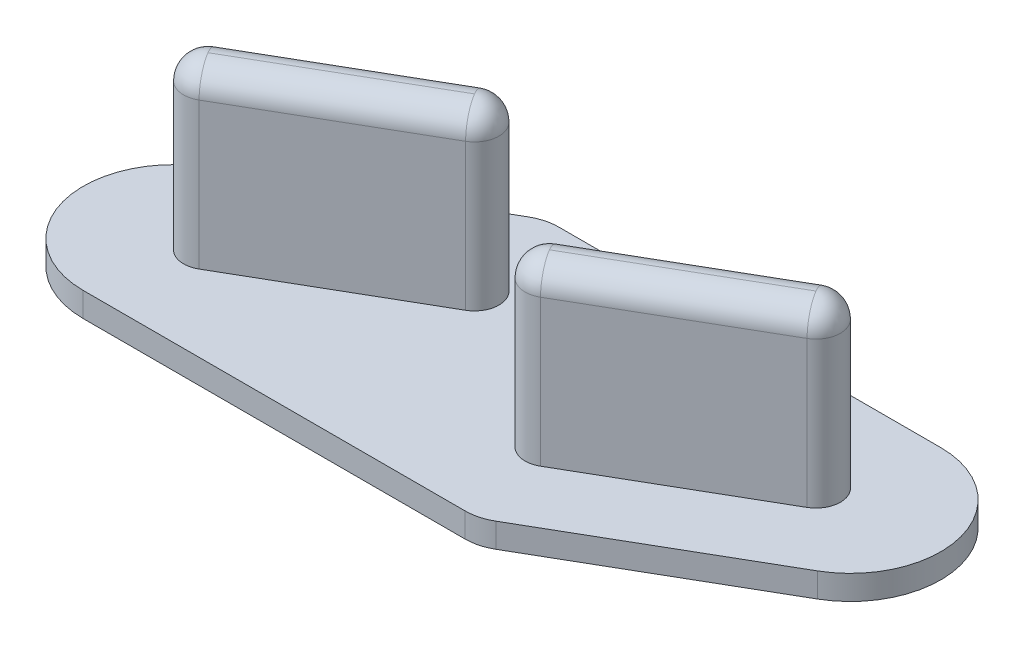
ISO-10303-21;
HEADER;
FILE_DESCRIPTION(('STEP AP214'),'2;1');
FILE_NAME('part.step','',(''),(''),'','','');
FILE_SCHEMA(('AUTOMOTIVE_DESIGN { 1 0 10303 214 1 1 1 1 }'));
ENDSEC;
DATA;
#1=APPLICATION_CONTEXT('core data for automotive mechanical design processes');
#2=APPLICATION_PROTOCOL_DEFINITION('international standard','automotive_design',2000,#1);
#3=PRODUCT_CONTEXT('',#1,'mechanical');
#4=PRODUCT('Part','Part','',(#3));
#5=PRODUCT_RELATED_PRODUCT_CATEGORY('part','',(#4));
#6=PRODUCT_DEFINITION_FORMATION('','',#4);
#7=PRODUCT_DEFINITION_CONTEXT('part definition',#1,'design');
#8=PRODUCT_DEFINITION('design','',#6,#7);
#9=PRODUCT_DEFINITION_SHAPE('','',#8);
#10=(LENGTH_UNIT() NAMED_UNIT(*) SI_UNIT(.MILLI.,.METRE.));
#11=(NAMED_UNIT(*) PLANE_ANGLE_UNIT() SI_UNIT($,.RADIAN.));
#12=(NAMED_UNIT(*) SI_UNIT($,.STERADIAN.) SOLID_ANGLE_UNIT());
#13=UNCERTAINTY_MEASURE_WITH_UNIT(LENGTH_MEASURE(1.E-05),#10,'distance_accuracy_value','');
#14=(GEOMETRIC_REPRESENTATION_CONTEXT(3) GLOBAL_UNCERTAINTY_ASSIGNED_CONTEXT((#13)) GLOBAL_UNIT_ASSIGNED_CONTEXT((#10,
#11,#12)) REPRESENTATION_CONTEXT('',''));
#15=CARTESIAN_POINT('',(0.,0.,0.));
#16=DIRECTION('',(0.,0.,1.));
#17=DIRECTION('',(1.,0.,0.));
#18=AXIS2_PLACEMENT_3D('',#15,#16,#17);
#19=CARTESIAN_POINT('',(0.,1.,0.));
#20=DIRECTION('',(0.,-1.,0.));
#21=DIRECTION('',(0.,0.,-1.));
#22=AXIS2_PLACEMENT_3D('',#19,#20,#21);
#23=CYLINDRICAL_SURFACE('',#22,3.7013113167179);
#24=CARTESIAN_POINT('',(0.,0.,0.));
#25=DIRECTION('',(0.,1.,0.));
#26=DIRECTION('',(0.,0.,1.));
#27=AXIS2_PLACEMENT_3D('',#24,#25,#26);
#28=CIRCLE('',#27,3.7013113167179);
#29=CARTESIAN_POINT('',(-1.85065565835895,0.,-3.20542962759253));
#30=VERTEX_POINT('',#29);
#31=CARTESIAN_POINT('',(0.,0.,3.7013113167179));
#32=VERTEX_POINT('',#31);
#33=EDGE_CURVE('E177',#30,#32,#28,.T.);
#34=ORIENTED_EDGE('',*,*,#33,.T.);
#35=DIRECTION('',(0.,-1.,0.));
#36=VECTOR('',#35,1.);
#37=CARTESIAN_POINT('',(0.,1.,3.7013113167179));
#38=LINE('',#37,#36);
#39=CARTESIAN_POINT('',(0.,1.,3.7013113167179));
#40=VERTEX_POINT('',#39);
#41=EDGE_CURVE('E130',#40,#32,#38,.T.);
#42=ORIENTED_EDGE('',*,*,#41,.F.);
#43=CARTESIAN_POINT('',(0.,1.,0.));
#44=DIRECTION('',(0.,1.,0.));
#45=DIRECTION('',(0.,0.,1.));
#46=AXIS2_PLACEMENT_3D('',#43,#44,#45);
#47=CIRCLE('',#46,3.7013113167179);
#48=CARTESIAN_POINT('',(-1.85065565835895,1.,-3.20542962759253));
#49=VERTEX_POINT('',#48);
#50=EDGE_CURVE('E158',#49,#40,#47,.T.);
#51=ORIENTED_EDGE('',*,*,#50,.F.);
#52=DIRECTION('',(0.,-1.,0.));
#53=VECTOR('',#52,1.);
#54=CARTESIAN_POINT('',(-1.85065565835895,1.,-3.20542962759253));
#55=LINE('',#54,#53);
#56=EDGE_CURVE('E151',#49,#30,#55,.T.);
#57=ORIENTED_EDGE('',*,*,#56,.T.);
#58=EDGE_LOOP('',(#34,#42,#51,#57));
#59=FACE_BOUND('',#58,.T.);
#60=ADVANCED_FACE('F39',(#59),#23,.T.);
#61=CARTESIAN_POINT('',(0.,1.,3.7013113167179));
#62=DIRECTION('',(0.,0.,-1.));
#63=DIRECTION('',(-1.,0.,0.));
#64=AXIS2_PLACEMENT_3D('',#61,#62,#63);
#65=PLANE('',#64);
#66=DIRECTION('',(1.,0.,0.));
#67=VECTOR('',#66,1.);
#68=CARTESIAN_POINT('',(0.,0.,3.7013113167179));
#69=LINE('',#68,#67);
#70=CARTESIAN_POINT('',(15.6506197265169,0.,3.7013113167179));
#71=VERTEX_POINT('',#70);
#72=EDGE_CURVE('E174',#32,#71,#69,.T.);
#73=ORIENTED_EDGE('',*,*,#72,.T.);
#74=DIRECTION('',(0.,-1.,0.));
#75=VECTOR('',#74,1.);
#76=CARTESIAN_POINT('',(15.6506197265169,1.,3.7013113167179));
#77=LINE('',#76,#75);
#78=CARTESIAN_POINT('',(15.6506197265169,1.,3.7013113167179));
#79=VERTEX_POINT('',#78);
#80=EDGE_CURVE('E133',#79,#71,#77,.T.);
#81=ORIENTED_EDGE('',*,*,#80,.F.);
#82=DIRECTION('',(1.,0.,0.));
#83=VECTOR('',#82,1.);
#84=CARTESIAN_POINT('',(0.,1.,3.7013113167179));
#85=LINE('',#84,#83);
#86=EDGE_CURVE('E198',#40,#79,#85,.T.);
#87=ORIENTED_EDGE('',*,*,#86,.F.);
#88=ORIENTED_EDGE('',*,*,#41,.T.);
#89=EDGE_LOOP('',(#73,#81,#87,#88));
#90=FACE_BOUND('',#89,.T.);
#91=ADVANCED_FACE('F291',(#90),#65,.F.);
#92=CARTESIAN_POINT('',(15.6506197265169,1.,1.7013113167179));
#93=DIRECTION('',(0.,-1.,0.));
#94=DIRECTION('',(0.,0.,-1.));
#95=AXIS2_PLACEMENT_3D('',#92,#93,#94);
#96=CYLINDRICAL_SURFACE('',#95,2.);
#97=CARTESIAN_POINT('',(15.6506197265169,0.,1.7013113167179));
#98=DIRECTION('',(0.,1.,0.));
#99=DIRECTION('',(0.,0.,1.));
#100=AXIS2_PLACEMENT_3D('',#97,#98,#99);
#101=CIRCLE('',#100,2.);
#102=CARTESIAN_POINT('',(16.6506197265169,0.,3.43336212428678));
#103=VERTEX_POINT('',#102);
#104=EDGE_CURVE('E171',#71,#103,#101,.T.);
#105=ORIENTED_EDGE('',*,*,#104,.T.);
#106=DIRECTION('',(0.,-1.,0.));
#107=VECTOR('',#106,1.);
#108=CARTESIAN_POINT('',(16.6506197265169,1.,3.43336212428678));
#109=LINE('',#108,#107);
#110=CARTESIAN_POINT('',(16.6506197265169,1.,3.43336212428678));
#111=VERTEX_POINT('',#110);
#112=EDGE_CURVE('E136',#111,#103,#109,.T.);
#113=ORIENTED_EDGE('',*,*,#112,.F.);
#114=CARTESIAN_POINT('',(15.6506197265169,1.,1.7013113167179));
#115=DIRECTION('',(0.,1.,0.));
#116=DIRECTION('',(0.,0.,1.));
#117=AXIS2_PLACEMENT_3D('',#114,#115,#116);
#118=CIRCLE('',#117,2.);
#119=EDGE_CURVE('E195',#79,#111,#118,.T.);
#120=ORIENTED_EDGE('',*,*,#119,.F.);
#121=ORIENTED_EDGE('',*,*,#80,.T.);
#122=EDGE_LOOP('',(#105,#113,#120,#121));
#123=FACE_BOUND('',#122,.T.);
#124=ADVANCED_FACE('F379',(#123),#96,.T.);
#125=CARTESIAN_POINT('',(16.6506197265169,1.,3.43336212428678));
#126=DIRECTION('',(-0.500000000000001,0.,-0.866025403784438));
#127=DIRECTION('',(-0.866025403784438,0.,0.500000000000001));
#128=AXIS2_PLACEMENT_3D('',#125,#126,#127);
#129=PLANE('',#128);
#130=DIRECTION('',(0.866025403784438,0.,-0.500000000000001));
#131=VECTOR('',#130,1.);
#132=CARTESIAN_POINT('',(16.6506197265169,0.,3.43336212428678));
#133=LINE('',#132,#131);
#134=CARTESIAN_POINT('',(25.0083015719437,0.,-1.39194773897166));
#135=VERTEX_POINT('',#134);
#136=EDGE_CURVE('E168',#103,#135,#133,.T.);
#137=ORIENTED_EDGE('',*,*,#136,.T.);
#138=DIRECTION('',(0.,-1.,0.));
#139=VECTOR('',#138,1.);
#140=CARTESIAN_POINT('',(25.0083015719437,1.,-1.39194773897166));
#141=LINE('',#140,#139);
#142=CARTESIAN_POINT('',(25.0083015719437,1.,-1.39194773897166));
#143=VERTEX_POINT('',#142);
#144=EDGE_CURVE('E139',#143,#135,#141,.T.);
#145=ORIENTED_EDGE('',*,*,#144,.F.);
#146=DIRECTION('',(0.866025403784438,0.,-0.500000000000001));
#147=VECTOR('',#146,1.);
#148=CARTESIAN_POINT('',(16.6506197265169,1.,3.43336212428678));
#149=LINE('',#148,#147);
#150=EDGE_CURVE('E192',#111,#143,#149,.T.);
#151=ORIENTED_EDGE('',*,*,#150,.F.);
#152=ORIENTED_EDGE('',*,*,#112,.T.);
#153=EDGE_LOOP('',(#137,#145,#151,#152));
#154=FACE_BOUND('',#153,.T.);
#155=ADVANCED_FACE('F376',(#154),#129,.F.);
#156=CARTESIAN_POINT('',(23.1576459135847,1.,-4.59737736656419));
#157=DIRECTION('',(0.,-1.,0.));
#158=DIRECTION('',(0.,0.,-1.));
#159=AXIS2_PLACEMENT_3D('',#156,#157,#158);
#160=CYLINDRICAL_SURFACE('',#159,3.7013113167179);
#161=CARTESIAN_POINT('',(23.1576459135847,0.,-4.59737736656419));
#162=DIRECTION('',(0.,1.,0.));
#163=DIRECTION('',(0.,0.,1.));
#164=AXIS2_PLACEMENT_3D('',#161,#162,#163);
#165=CIRCLE('',#164,3.7013113167179);
#166=CARTESIAN_POINT('',(23.1576459135847,0.,-8.29868868328209));
#167=VERTEX_POINT('',#166);
#168=EDGE_CURVE('E165',#135,#167,#165,.T.);
#169=ORIENTED_EDGE('',*,*,#168,.T.);
#170=DIRECTION('',(0.,-1.,0.));
#171=VECTOR('',#170,1.);
#172=CARTESIAN_POINT('',(23.1576459135847,1.,-8.29868868328209));
#173=LINE('',#172,#171);
#174=CARTESIAN_POINT('',(23.1576459135847,1.,-8.29868868328209));
#175=VERTEX_POINT('',#174);
#176=EDGE_CURVE('E142',#175,#167,#173,.T.);
#177=ORIENTED_EDGE('',*,*,#176,.F.);
#178=CARTESIAN_POINT('',(23.1576459135847,1.,-4.59737736656419));
#179=DIRECTION('',(0.,1.,0.));
#180=DIRECTION('',(0.,0.,1.));
#181=AXIS2_PLACEMENT_3D('',#178,#179,#180);
#182=CIRCLE('',#181,3.7013113167179);
#183=EDGE_CURVE('E189',#143,#175,#182,.T.);
#184=ORIENTED_EDGE('',*,*,#183,.F.);
#185=ORIENTED_EDGE('',*,*,#144,.T.);
#186=EDGE_LOOP('',(#169,#177,#184,#185));
#187=FACE_BOUND('',#186,.T.);
#188=ADVANCED_FACE('F372',(#187),#160,.T.);
#189=CARTESIAN_POINT('',(23.1576459135847,1.,-8.29868868328209));
#190=DIRECTION('',(0.,0.,1.));
#191=DIRECTION('',(1.,0.,0.));
#192=AXIS2_PLACEMENT_3D('',#189,#190,#191);
#193=PLANE('',#192);
#194=DIRECTION('',(-1.,0.,0.));
#195=VECTOR('',#194,1.);
#196=CARTESIAN_POINT('',(23.1576459135847,0.,-8.29868868328209));
#197=LINE('',#196,#195);
#198=CARTESIAN_POINT('',(7.50702618706789,0.,-8.2986886832821));
#199=VERTEX_POINT('',#198);
#200=EDGE_CURVE('E162',#167,#199,#197,.T.);
#201=ORIENTED_EDGE('',*,*,#200,.T.);
#202=DIRECTION('',(0.,-1.,0.));
#203=VECTOR('',#202,1.);
#204=CARTESIAN_POINT('',(7.50702618706789,1.,-8.2986886832821));
#205=LINE('',#204,#203);
#206=CARTESIAN_POINT('',(7.50702618706789,1.,-8.2986886832821));
#207=VERTEX_POINT('',#206);
#208=EDGE_CURVE('E145',#207,#199,#205,.T.);
#209=ORIENTED_EDGE('',*,*,#208,.F.);
#210=DIRECTION('',(-1.,0.,0.));
#211=VECTOR('',#210,1.);
#212=CARTESIAN_POINT('',(23.1576459135847,1.,-8.29868868328209));
#213=LINE('',#212,#211);
#214=EDGE_CURVE('E186',#175,#207,#213,.T.);
#215=ORIENTED_EDGE('',*,*,#214,.F.);
#216=ORIENTED_EDGE('',*,*,#176,.T.);
#217=EDGE_LOOP('',(#201,#209,#215,#216));
#218=FACE_BOUND('',#217,.T.);
#219=ADVANCED_FACE('F368',(#218),#193,.F.);
#220=CARTESIAN_POINT('',(7.50702618706789,1.,-6.2986886832821));
#221=DIRECTION('',(0.,-1.,0.));
#222=DIRECTION('',(0.,0.,-1.));
#223=AXIS2_PLACEMENT_3D('',#220,#221,#222);
#224=CYLINDRICAL_SURFACE('',#223,2.);
#225=CARTESIAN_POINT('',(7.50702618706789,0.,-6.2986886832821));
#226=DIRECTION('',(0.,1.,0.));
#227=DIRECTION('',(0.,0.,1.));
#228=AXIS2_PLACEMENT_3D('',#225,#226,#227);
#229=CIRCLE('',#228,2.);
#230=CARTESIAN_POINT('',(6.50702618706789,0.,-8.03073949085098));
#231=VERTEX_POINT('',#230);
#232=EDGE_CURVE('E159',#199,#231,#229,.T.);
#233=ORIENTED_EDGE('',*,*,#232,.T.);
#234=DIRECTION('',(0.,-1.,0.));
#235=VECTOR('',#234,1.);
#236=CARTESIAN_POINT('',(6.50702618706789,1.,-8.03073949085098));
#237=LINE('',#236,#235);
#238=CARTESIAN_POINT('',(6.50702618706789,1.,-8.03073949085098));
#239=VERTEX_POINT('',#238);
#240=EDGE_CURVE('E148',#239,#231,#237,.T.);
#241=ORIENTED_EDGE('',*,*,#240,.F.);
#242=CARTESIAN_POINT('',(7.50702618706789,1.,-6.2986886832821));
#243=DIRECTION('',(0.,1.,0.));
#244=DIRECTION('',(0.,0.,1.));
#245=AXIS2_PLACEMENT_3D('',#242,#243,#244);
#246=CIRCLE('',#245,2.);
#247=EDGE_CURVE('E183',#207,#239,#246,.T.);
#248=ORIENTED_EDGE('',*,*,#247,.F.);
#249=ORIENTED_EDGE('',*,*,#208,.T.);
#250=EDGE_LOOP('',(#233,#241,#248,#249));
#251=FACE_BOUND('',#250,.T.);
#252=ADVANCED_FACE('F360',(#251),#224,.T.);
#253=CARTESIAN_POINT('',(6.50702618706789,1.,-8.03073949085097));
#254=DIRECTION('',(0.500000000000001,0.,0.866025403784438));
#255=DIRECTION('',(0.866025403784438,0.,-0.500000000000001));
#256=AXIS2_PLACEMENT_3D('',#253,#254,#255);
#257=PLANE('',#256);
#258=DIRECTION('',(-0.866025403784438,0.,0.500000000000001));
#259=VECTOR('',#258,1.);
#260=CARTESIAN_POINT('',(6.50702618706789,0.,-8.03073949085097));
#261=LINE('',#260,#259);
#262=EDGE_CURVE('E155',#231,#30,#261,.T.);
#263=ORIENTED_EDGE('',*,*,#262,.T.);
#264=ORIENTED_EDGE('',*,*,#56,.F.);
#265=DIRECTION('',(-0.866025403784438,0.,0.500000000000001));
#266=VECTOR('',#265,1.);
#267=CARTESIAN_POINT('',(6.50702618706789,1.,-8.03073949085097));
#268=LINE('',#267,#266);
#269=EDGE_CURVE('E154',#239,#49,#268,.T.);
#270=ORIENTED_EDGE('',*,*,#269,.F.);
#271=ORIENTED_EDGE('',*,*,#240,.T.);
#272=EDGE_LOOP('',(#263,#264,#270,#271));
#273=FACE_BOUND('',#272,.T.);
#274=ADVANCED_FACE('F267',(#273),#257,.F.);
#275=CARTESIAN_POINT('',(0.,1.,0.));
#276=DIRECTION('',(0.,1.,0.));
#277=DIRECTION('',(0.,0.,1.));
#278=AXIS2_PLACEMENT_3D('',#275,#276,#277);
#279=PLANE('',#278);
#280=CARTESIAN_POINT('',(13.4893880968628,1.,-6.29868868328209));
#281=DIRECTION('',(0.,1.,0.));
#282=DIRECTION('',(0.,0.,1.));
#283=AXIS2_PLACEMENT_3D('',#280,#281,#282);
#284=CIRCLE('',#283,1.);
#285=CARTESIAN_POINT('',(13.4893880968628,1.,-5.29868868328209));
#286=VERTEX_POINT('',#285);
#287=EDGE_CURVE('E248',#286,#286,#284,.T.);
#288=ORIENTED_EDGE('',*,*,#287,.F.);
#289=EDGE_LOOP('',(#288));
#290=FACE_BOUND('',#289,.T.);
#291=CARTESIAN_POINT('',(8.04292457193011,1.,-4.29868868328213));
#292=DIRECTION('',(0.,1.,0.));
#293=DIRECTION('',(0.,0.,1.));
#294=AXIS2_PLACEMENT_3D('',#291,#292,#293);
#295=CIRCLE('',#294,1.);
#296=CARTESIAN_POINT('',(8.54292457193012,1.,-3.43266327949768));
#297=VERTEX_POINT('',#296);
#298=CARTESIAN_POINT('',(7.54292457193012,1.,-5.16471408706655));
#299=VERTEX_POINT('',#298);
#300=EDGE_CURVE('E243',#297,#299,#295,.T.);
#301=ORIENTED_EDGE('',*,*,#300,.F.);
#302=DIRECTION('',(0.866025403784438,0.,-0.500000000000001));
#303=VECTOR('',#302,1.);
#304=CARTESIAN_POINT('',(-9.85065565835894,1.,7.18687521782072));
#305=LINE('',#304,#303);
#306=CARTESIAN_POINT('',(1.61472134165461,1.,0.567336720502332));
#307=VERTEX_POINT('',#306);
#308=EDGE_CURVE('E101',#307,#297,#305,.T.);
#309=ORIENTED_EDGE('',*,*,#308,.F.);
#310=CARTESIAN_POINT('',(1.11472134165461,1.,-0.298688683282105));
#311=DIRECTION('',(0.,1.,0.));
#312=DIRECTION('',(0.,0.,1.));
#313=AXIS2_PLACEMENT_3D('',#310,#311,#312);
#314=CIRCLE('',#313,1.);
#315=CARTESIAN_POINT('',(0.61472134165461,1.,-1.16471408706654));
#316=VERTEX_POINT('',#315);
#317=EDGE_CURVE('E237',#316,#307,#314,.T.);
#318=ORIENTED_EDGE('',*,*,#317,.F.);
#319=DIRECTION('',(0.866025403784438,0.,-0.500000000000001));
#320=VECTOR('',#319,1.);
#321=CARTESIAN_POINT('',(-10.8506556583589,1.,5.45482441025184));
#322=LINE('',#321,#320);
#323=EDGE_CURVE('E240',#316,#299,#322,.T.);
#324=ORIENTED_EDGE('',*,*,#323,.T.);
#325=EDGE_LOOP('',(#301,#309,#318,#324));
#326=FACE_BOUND('',#325,.T.);
#327=CARTESIAN_POINT('',(22.0429245719301,1.,-4.29868868328212));
#328=DIRECTION('',(0.,1.,0.));
#329=DIRECTION('',(0.,0.,1.));
#330=AXIS2_PLACEMENT_3D('',#327,#328,#329);
#331=CIRCLE('',#330,1.);
#332=CARTESIAN_POINT('',(22.5429245719301,1.,-3.43266327949767));
#333=VERTEX_POINT('',#332);
#334=CARTESIAN_POINT('',(21.5429245719301,1.,-5.16471408706655));
#335=VERTEX_POINT('',#334);
#336=EDGE_CURVE('E220',#333,#335,#331,.T.);
#337=ORIENTED_EDGE('',*,*,#336,.F.);
#338=DIRECTION('',(0.866025403784438,0.,-0.500000000000001));
#339=VECTOR('',#338,1.);
#340=CARTESIAN_POINT('',(4.14934434164106,1.,7.18687521782073));
#341=LINE('',#340,#339);
#342=CARTESIAN_POINT('',(15.6147213416546,1.,0.567336720502338));
#343=VERTEX_POINT('',#342);
#344=EDGE_CURVE('E223',#343,#333,#341,.T.);
#345=ORIENTED_EDGE('',*,*,#344,.F.);
#346=CARTESIAN_POINT('',(15.1147213416546,1.,-0.298688683282099));
#347=DIRECTION('',(0.,1.,0.));
#348=DIRECTION('',(0.,0.,1.));
#349=AXIS2_PLACEMENT_3D('',#346,#347,#348);
#350=CIRCLE('',#349,1.);
#351=CARTESIAN_POINT('',(14.6147213416546,1.,-1.16471408706654));
#352=VERTEX_POINT('',#351);
#353=EDGE_CURVE('E214',#352,#343,#350,.T.);
#354=ORIENTED_EDGE('',*,*,#353,.F.);
#355=DIRECTION('',(0.866025403784438,0.,-0.500000000000001));
#356=VECTOR('',#355,1.);
#357=CARTESIAN_POINT('',(3.14934434164106,1.,5.45482441025185));
#358=LINE('',#357,#356);
#359=EDGE_CURVE('E217',#352,#335,#358,.T.);
#360=ORIENTED_EDGE('',*,*,#359,.T.);
#361=EDGE_LOOP('',(#337,#345,#354,#360));
#362=FACE_BOUND('',#361,.T.);
#363=ORIENTED_EDGE('',*,*,#50,.T.);
#364=ORIENTED_EDGE('',*,*,#86,.T.);
#365=ORIENTED_EDGE('',*,*,#119,.T.);
#366=ORIENTED_EDGE('',*,*,#150,.T.);
#367=ORIENTED_EDGE('',*,*,#183,.T.);
#368=ORIENTED_EDGE('',*,*,#214,.T.);
#369=ORIENTED_EDGE('',*,*,#247,.T.);
#370=ORIENTED_EDGE('',*,*,#269,.T.);
#371=EDGE_LOOP('',(#363,#364,#365,#366,#367,#368,#369,#370));
#372=FACE_BOUND('',#371,.T.);
#373=ADVANCED_FACE('F264',(#290,#326,#362,#372),#279,.T.);
#374=CARTESIAN_POINT('',(0.,0.,0.));
#375=DIRECTION('',(0.,1.,0.));
#376=DIRECTION('',(0.,0.,1.));
#377=AXIS2_PLACEMENT_3D('',#374,#375,#376);
#378=PLANE('',#377);
#379=CARTESIAN_POINT('',(13.4893880968628,0.,-6.29868868328209));
#380=DIRECTION('',(0.,1.,0.));
#381=DIRECTION('',(0.,0.,1.));
#382=AXIS2_PLACEMENT_3D('',#379,#380,#381);
#383=CIRCLE('',#382,1.);
#384=CARTESIAN_POINT('',(13.4893880968628,0.,-5.29868868328209));
#385=VERTEX_POINT('',#384);
#386=EDGE_CURVE('E97',#385,#385,#383,.T.);
#387=ORIENTED_EDGE('',*,*,#386,.T.);
#388=EDGE_LOOP('',(#387));
#389=FACE_BOUND('',#388,.T.);
#390=ORIENTED_EDGE('',*,*,#33,.F.);
#391=ORIENTED_EDGE('',*,*,#262,.F.);
#392=ORIENTED_EDGE('',*,*,#232,.F.);
#393=ORIENTED_EDGE('',*,*,#200,.F.);
#394=ORIENTED_EDGE('',*,*,#168,.F.);
#395=ORIENTED_EDGE('',*,*,#136,.F.);
#396=ORIENTED_EDGE('',*,*,#104,.F.);
#397=ORIENTED_EDGE('',*,*,#72,.F.);
#398=EDGE_LOOP('',(#390,#391,#392,#393,#394,#395,#396,#397));
#399=FACE_BOUND('',#398,.T.);
#400=ADVANCED_FACE('F254',(#389,#399),#378,.F.);
#401=CARTESIAN_POINT('',(4.14934434164106,8.,7.18687521782073));
#402=DIRECTION('',(-0.500000000000001,0.,-0.866025403784438));
#403=DIRECTION('',(-0.866025403784438,0.,0.500000000000001));
#404=AXIS2_PLACEMENT_3D('',#401,#402,#403);
#405=PLANE('',#404);
#406=DIRECTION('',(0.,-1.,0.));
#407=VECTOR('',#406,1.);
#408=CARTESIAN_POINT('',(22.5429245719301,8.,-3.43266327949767));
#409=LINE('',#408,#407);
#410=CARTESIAN_POINT('',(22.5429245719301,7.,-3.43266327949767));
#411=VERTEX_POINT('',#410);
#412=EDGE_CURVE('E180',#411,#333,#409,.T.);
#413=ORIENTED_EDGE('',*,*,#412,.F.);
#414=DIRECTION('',(0.866025403784438,0.,-0.500000000000001));
#415=VECTOR('',#414,1.);
#416=CARTESIAN_POINT('',(15.6147213416546,7.,0.567336720502336));
#417=LINE('',#416,#415);
#418=CARTESIAN_POINT('',(15.6147213416546,7.,0.567336720502338));
#419=VERTEX_POINT('',#418);
#420=EDGE_CURVE('E118',#411,#419,#417,.F.);
#421=ORIENTED_EDGE('',*,*,#420,.T.);
#422=DIRECTION('',(0.,-1.,0.));
#423=VECTOR('',#422,1.);
#424=CARTESIAN_POINT('',(15.6147213416546,8.,0.567336720502338));
#425=LINE('',#424,#423);
#426=EDGE_CURVE('E211',#419,#343,#425,.T.);
#427=ORIENTED_EDGE('',*,*,#426,.T.);
#428=ORIENTED_EDGE('',*,*,#344,.T.);
#429=EDGE_LOOP('',(#413,#421,#427,#428));
#430=FACE_BOUND('',#429,.T.);
#431=ADVANCED_FACE('F484',(#430),#405,.F.);
#432=CARTESIAN_POINT('',(22.0429245719301,8.,-4.29868868328212));
#433=DIRECTION('',(0.,-1.,0.));
#434=DIRECTION('',(0.,0.,-1.));
#435=AXIS2_PLACEMENT_3D('',#432,#433,#434);
#436=CYLINDRICAL_SURFACE('',#435,1.);
#437=DIRECTION('',(0.,-1.,0.));
#438=VECTOR('',#437,1.);
#439=CARTESIAN_POINT('',(21.5429245719301,8.,-5.16471408706655));
#440=LINE('',#439,#438);
#441=CARTESIAN_POINT('',(21.5429245719301,7.,-5.16471408706655));
#442=VERTEX_POINT('',#441);
#443=EDGE_CURVE('E205',#442,#335,#440,.T.);
#444=ORIENTED_EDGE('',*,*,#443,.F.);
#445=CARTESIAN_POINT('',(22.0429245719301,7.,-4.29868868328212));
#446=DIRECTION('',(0.,-1.,0.));
#447=DIRECTION('',(0.,0.,-1.));
#448=AXIS2_PLACEMENT_3D('',#445,#446,#447);
#449=CIRCLE('',#448,1.);
#450=EDGE_CURVE('E121',#442,#411,#449,.T.);
#451=ORIENTED_EDGE('',*,*,#450,.T.);
#452=ORIENTED_EDGE('',*,*,#412,.T.);
#453=ORIENTED_EDGE('',*,*,#336,.T.);
#454=EDGE_LOOP('',(#444,#451,#452,#453));
#455=FACE_BOUND('',#454,.T.);
#456=ADVANCED_FACE('F476',(#455),#436,.T.);
#457=CARTESIAN_POINT('',(3.14934434164106,8.,5.45482441025185));
#458=DIRECTION('',(-0.500000000000001,0.,-0.866025403784438));
#459=DIRECTION('',(-0.866025403784438,0.,0.500000000000001));
#460=AXIS2_PLACEMENT_3D('',#457,#458,#459);
#461=PLANE('',#460);
#462=DIRECTION('',(0.,-1.,0.));
#463=VECTOR('',#462,1.);
#464=CARTESIAN_POINT('',(14.6147213416546,8.,-1.16471408706654));
#465=LINE('',#464,#463);
#466=CARTESIAN_POINT('',(14.6147213416546,7.,-1.16471408706654));
#467=VERTEX_POINT('',#466);
#468=EDGE_CURVE('E208',#467,#352,#465,.T.);
#469=ORIENTED_EDGE('',*,*,#468,.F.);
#470=DIRECTION('',(0.866025403784438,0.,-0.500000000000001));
#471=VECTOR('',#470,1.);
#472=CARTESIAN_POINT('',(3.14934434164106,7.,5.45482441025185));
#473=LINE('',#472,#471);
#474=EDGE_CURVE('E124',#467,#442,#473,.T.);
#475=ORIENTED_EDGE('',*,*,#474,.T.);
#476=ORIENTED_EDGE('',*,*,#443,.T.);
#477=ORIENTED_EDGE('',*,*,#359,.F.);
#478=EDGE_LOOP('',(#469,#475,#476,#477));
#479=FACE_BOUND('',#478,.T.);
#480=ADVANCED_FACE('F468',(#479),#461,.T.);
#481=CARTESIAN_POINT('',(15.1147213416546,8.,-0.298688683282099));
#482=DIRECTION('',(0.,-1.,0.));
#483=DIRECTION('',(0.,0.,-1.));
#484=AXIS2_PLACEMENT_3D('',#481,#482,#483);
#485=CYLINDRICAL_SURFACE('',#484,1.);
#486=ORIENTED_EDGE('',*,*,#426,.F.);
#487=CARTESIAN_POINT('',(15.1147213416546,7.,-0.298688683282099));
#488=DIRECTION('',(0.,-1.,0.));
#489=DIRECTION('',(0.,0.,-1.));
#490=AXIS2_PLACEMENT_3D('',#487,#488,#489);
#491=CIRCLE('',#490,1.);
#492=EDGE_CURVE('E127',#419,#467,#491,.T.);
#493=ORIENTED_EDGE('',*,*,#492,.T.);
#494=ORIENTED_EDGE('',*,*,#468,.T.);
#495=ORIENTED_EDGE('',*,*,#353,.T.);
#496=EDGE_LOOP('',(#486,#493,#494,#495));
#497=FACE_BOUND('',#496,.T.);
#498=ADVANCED_FACE('F461',(#497),#485,.T.);
#499=CARTESIAN_POINT('',(-9.85065565835894,8.,7.18687521782072));
#500=DIRECTION('',(-0.500000000000001,0.,-0.866025403784438));
#501=DIRECTION('',(-0.866025403784438,0.,0.500000000000001));
#502=AXIS2_PLACEMENT_3D('',#499,#500,#501);
#503=PLANE('',#502);
#504=DIRECTION('',(0.,-1.,0.));
#505=VECTOR('',#504,1.);
#506=CARTESIAN_POINT('',(8.54292457193012,8.,-3.43266327949768));
#507=LINE('',#506,#505);
#508=CARTESIAN_POINT('',(8.54292457193012,7.,-3.43266327949768));
#509=VERTEX_POINT('',#508);
#510=EDGE_CURVE('E226',#509,#297,#507,.T.);
#511=ORIENTED_EDGE('',*,*,#510,.F.);
#512=DIRECTION('',(0.866025403784438,0.,-0.500000000000001));
#513=VECTOR('',#512,1.);
#514=CARTESIAN_POINT('',(1.61472134165461,7.,0.567336720502332));
#515=LINE('',#514,#513);
#516=CARTESIAN_POINT('',(1.61472134165461,7.,0.567336720502332));
#517=VERTEX_POINT('',#516);
#518=EDGE_CURVE('E11',#509,#517,#515,.F.);
#519=ORIENTED_EDGE('',*,*,#518,.T.);
#520=DIRECTION('',(0.,-1.,0.));
#521=VECTOR('',#520,1.);
#522=CARTESIAN_POINT('',(1.61472134165461,8.,0.567336720502332));
#523=LINE('',#522,#521);
#524=EDGE_CURVE('E234',#517,#307,#523,.T.);
#525=ORIENTED_EDGE('',*,*,#524,.T.);
#526=ORIENTED_EDGE('',*,*,#308,.T.);
#527=EDGE_LOOP('',(#511,#519,#525,#526));
#528=FACE_BOUND('',#527,.T.);
#529=ADVANCED_FACE('F454',(#528),#503,.F.);
#530=CARTESIAN_POINT('',(8.04292457193011,8.,-4.29868868328213));
#531=DIRECTION('',(0.,-1.,0.));
#532=DIRECTION('',(0.,0.,-1.));
#533=AXIS2_PLACEMENT_3D('',#530,#531,#532);
#534=CYLINDRICAL_SURFACE('',#533,1.);
#535=DIRECTION('',(0.,-1.,0.));
#536=VECTOR('',#535,1.);
#537=CARTESIAN_POINT('',(7.54292457193012,8.,-5.16471408706655));
#538=LINE('',#537,#536);
#539=CARTESIAN_POINT('',(7.54292457193012,7.,-5.16471408706655));
#540=VERTEX_POINT('',#539);
#541=EDGE_CURVE('E228',#540,#299,#538,.T.);
#542=ORIENTED_EDGE('',*,*,#541,.F.);
#543=CARTESIAN_POINT('',(8.04292457193011,7.,-4.29868868328213));
#544=DIRECTION('',(0.,-1.,0.));
#545=DIRECTION('',(0.,0.,-1.));
#546=AXIS2_PLACEMENT_3D('',#543,#544,#545);
#547=CIRCLE('',#546,1.);
#548=EDGE_CURVE('E49',#540,#509,#547,.T.);
#549=ORIENTED_EDGE('',*,*,#548,.T.);
#550=ORIENTED_EDGE('',*,*,#510,.T.);
#551=ORIENTED_EDGE('',*,*,#300,.T.);
#552=EDGE_LOOP('',(#542,#549,#550,#551));
#553=FACE_BOUND('',#552,.T.);
#554=ADVANCED_FACE('F447',(#553),#534,.T.);
#555=CARTESIAN_POINT('',(-10.8506556583589,8.,5.45482441025184));
#556=DIRECTION('',(-0.500000000000001,0.,-0.866025403784438));
#557=DIRECTION('',(-0.866025403784438,0.,0.500000000000001));
#558=AXIS2_PLACEMENT_3D('',#555,#556,#557);
#559=PLANE('',#558);
#560=DIRECTION('',(0.,-1.,0.));
#561=VECTOR('',#560,1.);
#562=CARTESIAN_POINT('',(0.614721341654609,8.,-1.16471408706654));
#563=LINE('',#562,#561);
#564=CARTESIAN_POINT('',(0.614721341654609,7.,-1.16471408706654));
#565=VERTEX_POINT('',#564);
#566=EDGE_CURVE('E231',#565,#316,#563,.T.);
#567=ORIENTED_EDGE('',*,*,#566,.F.);
#568=DIRECTION('',(0.866025403784438,0.,-0.500000000000001));
#569=VECTOR('',#568,1.);
#570=CARTESIAN_POINT('',(-10.8506556583589,7.,5.45482441025184));
#571=LINE('',#570,#569);
#572=EDGE_CURVE('E113',#565,#540,#571,.T.);
#573=ORIENTED_EDGE('',*,*,#572,.T.);
#574=ORIENTED_EDGE('',*,*,#541,.T.);
#575=ORIENTED_EDGE('',*,*,#323,.F.);
#576=EDGE_LOOP('',(#567,#573,#574,#575));
#577=FACE_BOUND('',#576,.T.);
#578=ADVANCED_FACE('F335',(#577),#559,.T.);
#579=CARTESIAN_POINT('',(1.11472134165461,8.,-0.298688683282105));
#580=DIRECTION('',(0.,-1.,0.));
#581=DIRECTION('',(0.,0.,-1.));
#582=AXIS2_PLACEMENT_3D('',#579,#580,#581);
#583=CYLINDRICAL_SURFACE('',#582,1.);
#584=ORIENTED_EDGE('',*,*,#524,.F.);
#585=CARTESIAN_POINT('',(1.11472134165461,7.,-0.298688683282105));
#586=DIRECTION('',(0.,-1.,0.));
#587=DIRECTION('',(0.,0.,-1.));
#588=AXIS2_PLACEMENT_3D('',#585,#586,#587);
#589=CIRCLE('',#588,1.);
#590=EDGE_CURVE('E115',#517,#565,#589,.T.);
#591=ORIENTED_EDGE('',*,*,#590,.T.);
#592=ORIENTED_EDGE('',*,*,#566,.T.);
#593=ORIENTED_EDGE('',*,*,#317,.T.);
#594=EDGE_LOOP('',(#584,#591,#592,#593));
#595=FACE_BOUND('',#594,.T.);
#596=ADVANCED_FACE('F333',(#595),#583,.T.);
#597=CARTESIAN_POINT('',(22.0429245719301,7.,-4.29868868328212));
#598=DIRECTION('',(0.,1.,0.));
#599=DIRECTION('',(0.,0.,1.));
#600=AXIS2_PLACEMENT_3D('',#597,#598,#599);
#601=SPHERICAL_SURFACE('',#600,1.);
#602=CARTESIAN_POINT('',(22.0429245719301,7.,-4.29868868328212));
#603=DIRECTION('',(-0.866025403784438,0.,0.500000000000001));
#604=DIRECTION('',(0.500000000000001,0.,0.866025403784438));
#605=AXIS2_PLACEMENT_3D('',#602,#603,#604);
#606=CIRCLE('',#605,1.);
#607=CARTESIAN_POINT('',(22.0429245719301,8.,-4.29868868328211));
#608=VERTEX_POINT('',#607);
#609=EDGE_CURVE('E104',#411,#608,#606,.T.);
#610=ORIENTED_EDGE('',*,*,#609,.F.);
#611=ORIENTED_EDGE('',*,*,#450,.F.);
#612=CARTESIAN_POINT('',(22.0429245719301,7.,-4.29868868328212));
#613=DIRECTION('',(-0.866025403784439,0.,0.5));
#614=DIRECTION('',(0.5,0.,0.866025403784439));
#615=AXIS2_PLACEMENT_3D('',#612,#613,#614);
#616=CIRCLE('',#615,1.);
#617=EDGE_CURVE('E98',#608,#442,#616,.T.);
#618=ORIENTED_EDGE('',*,*,#617,.F.);
#619=EDGE_LOOP('',(#610,#611,#618));
#620=FACE_BOUND('',#619,.T.);
#621=ADVANCED_FACE('F405',(#620),#601,.T.);
#622=CARTESIAN_POINT('',(3.64934434164106,7.,6.32084981403629));
#623=DIRECTION('',(0.866025403784438,0.,-0.500000000000001));
#624=DIRECTION('',(-0.500000000000001,0.,-0.866025403784438));
#625=AXIS2_PLACEMENT_3D('',#622,#623,#624);
#626=CYLINDRICAL_SURFACE('',#625,1.);
#627=DIRECTION('',(0.866025403784438,0.,-0.500000000000001));
#628=VECTOR('',#627,1.);
#629=CARTESIAN_POINT('',(3.64934434164106,8.,6.32084981403629));
#630=LINE('',#629,#628);
#631=CARTESIAN_POINT('',(15.1147213416546,8.,-0.298688683282099));
#632=VERTEX_POINT('',#631);
#633=EDGE_CURVE('E102',#608,#632,#630,.F.);
#634=ORIENTED_EDGE('',*,*,#633,.F.);
#635=ORIENTED_EDGE('',*,*,#617,.T.);
#636=ORIENTED_EDGE('',*,*,#474,.F.);
#637=CARTESIAN_POINT('',(15.1147213416546,7.,-0.298688683282099));
#638=DIRECTION('',(-0.866025403784437,0.,0.500000000000002));
#639=DIRECTION('',(0.500000000000002,0.,0.866025403784437));
#640=AXIS2_PLACEMENT_3D('',#637,#638,#639);
#641=CIRCLE('',#640,1.);
#642=EDGE_CURVE('E107',#632,#467,#641,.T.);
#643=ORIENTED_EDGE('',*,*,#642,.F.);
#644=EDGE_LOOP('',(#634,#635,#636,#643));
#645=FACE_BOUND('',#644,.T.);
#646=ADVANCED_FACE('F401',(#645),#626,.T.);
#647=CARTESIAN_POINT('',(3.64934434164106,7.,6.32084981403629));
#648=DIRECTION('',(-0.866025403784438,0.,0.500000000000001));
#649=DIRECTION('',(0.500000000000001,0.,0.866025403784438));
#650=AXIS2_PLACEMENT_3D('',#647,#648,#649);
#651=CYLINDRICAL_SURFACE('',#650,1.);
#652=ORIENTED_EDGE('',*,*,#609,.T.);
#653=ORIENTED_EDGE('',*,*,#633,.T.);
#654=CARTESIAN_POINT('',(15.1147213416546,7.,-0.2986886832821));
#655=DIRECTION('',(-0.866025403784438,0.,0.500000000000001));
#656=DIRECTION('',(0.500000000000001,0.,0.866025403784438));
#657=AXIS2_PLACEMENT_3D('',#654,#655,#656);
#658=CIRCLE('',#657,1.);
#659=EDGE_CURVE('E86',#419,#632,#658,.T.);
#660=ORIENTED_EDGE('',*,*,#659,.F.);
#661=ORIENTED_EDGE('',*,*,#420,.F.);
#662=EDGE_LOOP('',(#652,#653,#660,#661));
#663=FACE_BOUND('',#662,.T.);
#664=ADVANCED_FACE('F397',(#663),#651,.T.);
#665=CARTESIAN_POINT('',(15.1147213416546,7.,-0.298688683282099));
#666=DIRECTION('',(0.,1.,0.));
#667=DIRECTION('',(0.,0.,1.));
#668=AXIS2_PLACEMENT_3D('',#665,#666,#667);
#669=SPHERICAL_SURFACE('',#668,1.);
#670=ORIENTED_EDGE('',*,*,#642,.T.);
#671=ORIENTED_EDGE('',*,*,#492,.F.);
#672=ORIENTED_EDGE('',*,*,#659,.T.);
#673=EDGE_LOOP('',(#670,#671,#672));
#674=FACE_BOUND('',#673,.T.);
#675=ADVANCED_FACE('F394',(#674),#669,.T.);
#676=CARTESIAN_POINT('',(8.04292457193011,7.,-4.29868868328213));
#677=DIRECTION('',(0.,1.,0.));
#678=DIRECTION('',(0.,0.,1.));
#679=AXIS2_PLACEMENT_3D('',#676,#677,#678);
#680=SPHERICAL_SURFACE('',#679,1.);
#681=CARTESIAN_POINT('',(8.04292457193011,7.,-4.29868868328213));
#682=DIRECTION('',(-0.866025403784437,0.,0.500000000000002));
#683=DIRECTION('',(0.500000000000002,0.,0.866025403784437));
#684=AXIS2_PLACEMENT_3D('',#681,#682,#683);
#685=CIRCLE('',#684,1.);
#686=CARTESIAN_POINT('',(8.04292457193012,8.,-4.29868868328211));
#687=VERTEX_POINT('',#686);
#688=EDGE_CURVE('E82',#509,#687,#685,.T.);
#689=ORIENTED_EDGE('',*,*,#688,.F.);
#690=ORIENTED_EDGE('',*,*,#548,.F.);
#691=CARTESIAN_POINT('',(8.04292457193011,7.,-4.29868868328213));
#692=DIRECTION('',(-0.866025403784439,0.,0.499999999999999));
#693=DIRECTION('',(0.499999999999999,0.,0.866025403784439));
#694=AXIS2_PLACEMENT_3D('',#691,#692,#693);
#695=CIRCLE('',#694,1.);
#696=EDGE_CURVE('E43',#687,#540,#695,.T.);
#697=ORIENTED_EDGE('',*,*,#696,.F.);
#698=EDGE_LOOP('',(#689,#690,#697));
#699=FACE_BOUND('',#698,.T.);
#700=ADVANCED_FACE('F41',(#699),#680,.T.);
#701=CARTESIAN_POINT('',(-10.3506556583589,7.,6.32084981403628));
#702=DIRECTION('',(0.866025403784438,0.,-0.500000000000001));
#703=DIRECTION('',(-0.500000000000001,0.,-0.866025403784438));
#704=AXIS2_PLACEMENT_3D('',#701,#702,#703);
#705=CYLINDRICAL_SURFACE('',#704,1.);
#706=DIRECTION('',(0.866025403784438,0.,-0.500000000000001));
#707=VECTOR('',#706,1.);
#708=CARTESIAN_POINT('',(-10.3506556583589,8.,6.32084981403628));
#709=LINE('',#708,#707);
#710=CARTESIAN_POINT('',(1.11472134165461,8.,-0.298688683282105));
#711=VERTEX_POINT('',#710);
#712=EDGE_CURVE('E76',#687,#711,#709,.F.);
#713=ORIENTED_EDGE('',*,*,#712,.F.);
#714=ORIENTED_EDGE('',*,*,#696,.T.);
#715=ORIENTED_EDGE('',*,*,#572,.F.);
#716=CARTESIAN_POINT('',(1.11472134165461,7.,-0.298688683282105));
#717=DIRECTION('',(-0.866025403784438,0.,0.500000000000001));
#718=DIRECTION('',(0.500000000000001,0.,0.866025403784438));
#719=AXIS2_PLACEMENT_3D('',#716,#717,#718);
#720=CIRCLE('',#719,1.);
#721=EDGE_CURVE('E89',#711,#565,#720,.T.);
#722=ORIENTED_EDGE('',*,*,#721,.F.);
#723=EDGE_LOOP('',(#713,#714,#715,#722));
#724=FACE_BOUND('',#723,.T.);
#725=ADVANCED_FACE('F87',(#724),#705,.T.);
#726=CARTESIAN_POINT('',(-10.3506556583589,7.,6.32084981403628));
#727=DIRECTION('',(-0.866025403784438,0.,0.500000000000001));
#728=DIRECTION('',(0.500000000000001,0.,0.866025403784438));
#729=AXIS2_PLACEMENT_3D('',#726,#727,#728);
#730=CYLINDRICAL_SURFACE('',#729,1.);
#731=ORIENTED_EDGE('',*,*,#688,.T.);
#732=ORIENTED_EDGE('',*,*,#712,.T.);
#733=CARTESIAN_POINT('',(1.11472134165461,7.,-0.298688683282106));
#734=DIRECTION('',(-0.866025403784438,0.,0.500000000000001));
#735=DIRECTION('',(0.500000000000001,0.,0.866025403784438));
#736=AXIS2_PLACEMENT_3D('',#733,#734,#735);
#737=CIRCLE('',#736,1.);
#738=EDGE_CURVE('E93',#517,#711,#737,.T.);
#739=ORIENTED_EDGE('',*,*,#738,.F.);
#740=ORIENTED_EDGE('',*,*,#518,.F.);
#741=EDGE_LOOP('',(#731,#732,#739,#740));
#742=FACE_BOUND('',#741,.T.);
#743=ADVANCED_FACE('F91',(#742),#730,.T.);
#744=CARTESIAN_POINT('',(1.11472134165461,7.,-0.298688683282105));
#745=DIRECTION('',(0.,1.,0.));
#746=DIRECTION('',(0.,0.,1.));
#747=AXIS2_PLACEMENT_3D('',#744,#745,#746);
#748=SPHERICAL_SURFACE('',#747,1.);
#749=ORIENTED_EDGE('',*,*,#721,.T.);
#750=ORIENTED_EDGE('',*,*,#590,.F.);
#751=ORIENTED_EDGE('',*,*,#738,.T.);
#752=EDGE_LOOP('',(#749,#750,#751));
#753=FACE_BOUND('',#752,.T.);
#754=ADVANCED_FACE('F260',(#753),#748,.T.);
#755=CARTESIAN_POINT('',(13.4893880968628,0.,-6.29868868328209));
#756=DIRECTION('',(0.,1.,0.));
#757=DIRECTION('',(0.,0.,1.));
#758=AXIS2_PLACEMENT_3D('',#755,#756,#757);
#759=CYLINDRICAL_SURFACE('',#758,1.);
#760=ORIENTED_EDGE('',*,*,#386,.F.);
#761=EDGE_LOOP('',(#760));
#762=FACE_BOUND('',#761,.T.);
#763=ORIENTED_EDGE('',*,*,#287,.T.);
#764=EDGE_LOOP('',(#763));
#765=FACE_BOUND('',#764,.T.);
#766=ADVANCED_FACE('F257',(#762,#765),#759,.F.);
#767=CLOSED_SHELL('',(#60,#91,#124,#155,#188,#219,#252,#274,#373,#400,#431,#456,#480,#498,#529,
#554,#578,#596,#621,#646,#664,#675,#700,#725,#743,#754,#766));
#768=MANIFOLD_SOLID_BREP('B2',#767);
#769=ADVANCED_BREP_SHAPE_REPRESENTATION('',(#18,#768),#14);
#770=SHAPE_DEFINITION_REPRESENTATION(#9,#769);
ENDSEC;
END-ISO-10303-21;
